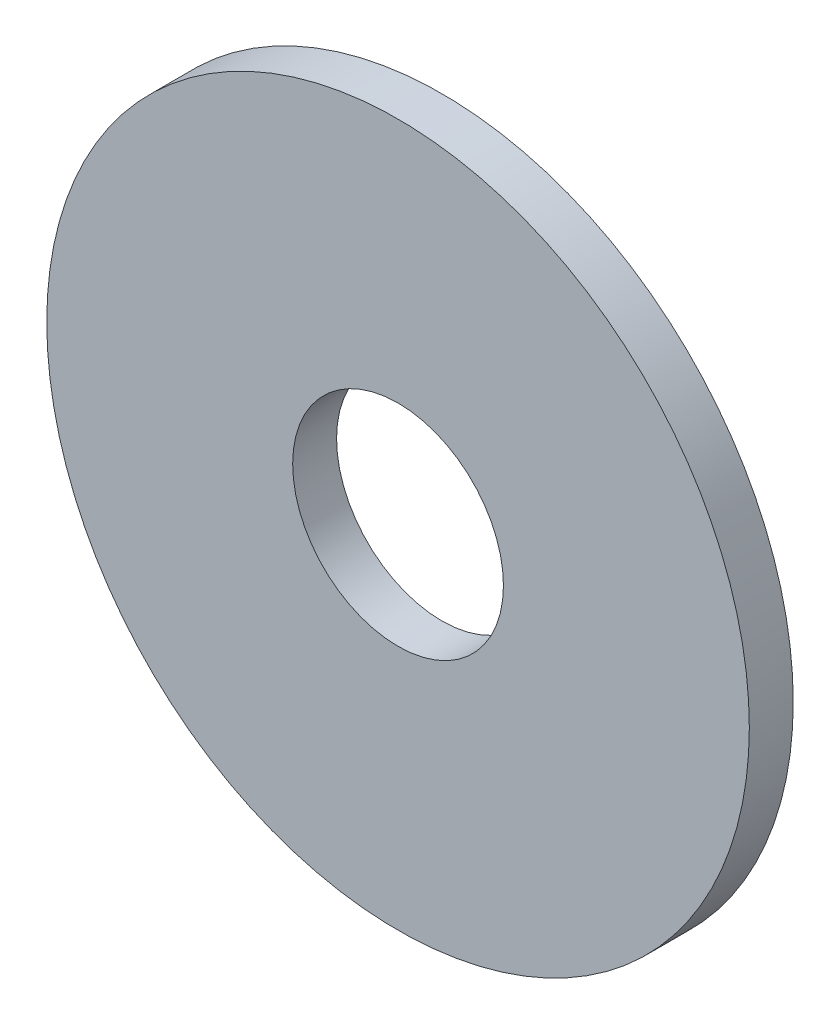
ISO-10303-21;
HEADER;
FILE_DESCRIPTION(('STEP AP214'),'2;1');
FILE_NAME('part.step','',(''),(''),'','','');
FILE_SCHEMA(('AUTOMOTIVE_DESIGN { 1 0 10303 214 1 1 1 1 }'));
ENDSEC;
DATA;
#1=APPLICATION_CONTEXT('core data for automotive mechanical design processes');
#2=APPLICATION_PROTOCOL_DEFINITION('international standard','automotive_design',2000,#1);
#3=PRODUCT_CONTEXT('',#1,'mechanical');
#4=PRODUCT('Part','Part','',(#3));
#5=PRODUCT_RELATED_PRODUCT_CATEGORY('part','',(#4));
#6=PRODUCT_DEFINITION_FORMATION('','',#4);
#7=PRODUCT_DEFINITION_CONTEXT('part definition',#1,'design');
#8=PRODUCT_DEFINITION('design','',#6,#7);
#9=PRODUCT_DEFINITION_SHAPE('','',#8);
#10=(LENGTH_UNIT() NAMED_UNIT(*) SI_UNIT(.MILLI.,.METRE.));
#11=(NAMED_UNIT(*) PLANE_ANGLE_UNIT() SI_UNIT($,.RADIAN.));
#12=(NAMED_UNIT(*) SI_UNIT($,.STERADIAN.) SOLID_ANGLE_UNIT());
#13=UNCERTAINTY_MEASURE_WITH_UNIT(LENGTH_MEASURE(1.E-05),#10,'distance_accuracy_value','');
#14=(GEOMETRIC_REPRESENTATION_CONTEXT(3) GLOBAL_UNCERTAINTY_ASSIGNED_CONTEXT((#13)) GLOBAL_UNIT_ASSIGNED_CONTEXT((#10,
#11,#12)) REPRESENTATION_CONTEXT('',''));
#15=CARTESIAN_POINT('',(0.,0.,0.));
#16=DIRECTION('',(0.,0.,1.));
#17=DIRECTION('',(1.,0.,0.));
#18=AXIS2_PLACEMENT_3D('',#15,#16,#17);
#19=CARTESIAN_POINT('',(0.,0.,1.5875));
#20=DIRECTION('',(0.,0.,1.));
#21=DIRECTION('',(1.,0.,0.));
#22=AXIS2_PLACEMENT_3D('',#19,#20,#21);
#23=PLANE('',#22);
#24=CARTESIAN_POINT('',(0.,0.,1.5875));
#25=DIRECTION('',(0.,0.,1.));
#26=DIRECTION('',(1.,0.,0.));
#27=AXIS2_PLACEMENT_3D('',#24,#25,#26);
#28=CIRCLE('',#27,12.7);
#29=CARTESIAN_POINT('',(12.7,0.,1.5875));
#30=VERTEX_POINT('',#29);
#31=EDGE_CURVE('E10',#30,#30,#28,.T.);
#32=ORIENTED_EDGE('',*,*,#31,.T.);
#33=EDGE_LOOP('',(#32));
#34=FACE_BOUND('',#33,.T.);
#35=CARTESIAN_POINT('',(0.,0.,1.5875));
#36=DIRECTION('',(0.,0.,1.));
#37=DIRECTION('',(1.,0.,0.));
#38=AXIS2_PLACEMENT_3D('',#35,#36,#37);
#39=CIRCLE('',#38,3.81);
#40=CARTESIAN_POINT('',(3.81,0.,1.5875));
#41=VERTEX_POINT('',#40);
#42=EDGE_CURVE('E42',#41,#41,#39,.T.);
#43=ORIENTED_EDGE('',*,*,#42,.F.);
#44=EDGE_LOOP('',(#43));
#45=FACE_BOUND('',#44,.T.);
#46=ADVANCED_FACE('F31',(#34,#45),#23,.T.);
#47=CARTESIAN_POINT('',(0.,0.,0.));
#48=DIRECTION('',(0.,0.,1.));
#49=DIRECTION('',(1.,0.,0.));
#50=AXIS2_PLACEMENT_3D('',#47,#48,#49);
#51=PLANE('',#50);
#52=CARTESIAN_POINT('',(0.,0.,0.));
#53=DIRECTION('',(0.,0.,1.));
#54=DIRECTION('',(1.,0.,0.));
#55=AXIS2_PLACEMENT_3D('',#52,#53,#54);
#56=CIRCLE('',#55,12.7);
#57=CARTESIAN_POINT('',(12.7,0.,0.));
#58=VERTEX_POINT('',#57);
#59=EDGE_CURVE('E35',#58,#58,#56,.T.);
#60=ORIENTED_EDGE('',*,*,#59,.F.);
#61=EDGE_LOOP('',(#60));
#62=FACE_BOUND('',#61,.T.);
#63=CARTESIAN_POINT('',(0.,0.,0.));
#64=DIRECTION('',(0.,0.,1.));
#65=DIRECTION('',(1.,0.,0.));
#66=AXIS2_PLACEMENT_3D('',#63,#64,#65);
#67=CIRCLE('',#66,3.81);
#68=CARTESIAN_POINT('',(3.81,0.,0.));
#69=VERTEX_POINT('',#68);
#70=EDGE_CURVE('E44',#69,#69,#67,.T.);
#71=ORIENTED_EDGE('',*,*,#70,.T.);
#72=EDGE_LOOP('',(#71));
#73=FACE_BOUND('',#72,.T.);
#74=ADVANCED_FACE('F54',(#62,#73),#51,.F.);
#75=CARTESIAN_POINT('',(0.,0.,1.5875));
#76=DIRECTION('',(0.,0.,-1.));
#77=DIRECTION('',(-1.,0.,0.));
#78=AXIS2_PLACEMENT_3D('',#75,#76,#77);
#79=CYLINDRICAL_SURFACE('',#78,12.7);
#80=ORIENTED_EDGE('',*,*,#31,.F.);
#81=EDGE_LOOP('',(#80));
#82=FACE_BOUND('',#81,.T.);
#83=ORIENTED_EDGE('',*,*,#59,.T.);
#84=EDGE_LOOP('',(#83));
#85=FACE_BOUND('',#84,.T.);
#86=ADVANCED_FACE('F33',(#82,#85),#79,.T.);
#87=CARTESIAN_POINT('',(0.,0.,1.5875));
#88=DIRECTION('',(0.,0.,-1.));
#89=DIRECTION('',(-1.,0.,0.));
#90=AXIS2_PLACEMENT_3D('',#87,#88,#89);
#91=CYLINDRICAL_SURFACE('',#90,3.81);
#92=ORIENTED_EDGE('',*,*,#42,.T.);
#93=EDGE_LOOP('',(#92));
#94=FACE_BOUND('',#93,.T.);
#95=ORIENTED_EDGE('',*,*,#70,.F.);
#96=EDGE_LOOP('',(#95));
#97=FACE_BOUND('',#96,.T.);
#98=ADVANCED_FACE('F50',(#94,#97),#91,.F.);
#99=CLOSED_SHELL('',(#46,#74,#86,#98));
#100=MANIFOLD_SOLID_BREP('B2',#99);
#101=ADVANCED_BREP_SHAPE_REPRESENTATION('',(#18,#100),#14);
#102=SHAPE_DEFINITION_REPRESENTATION(#9,#101);
ENDSEC;
END-ISO-10303-21;
